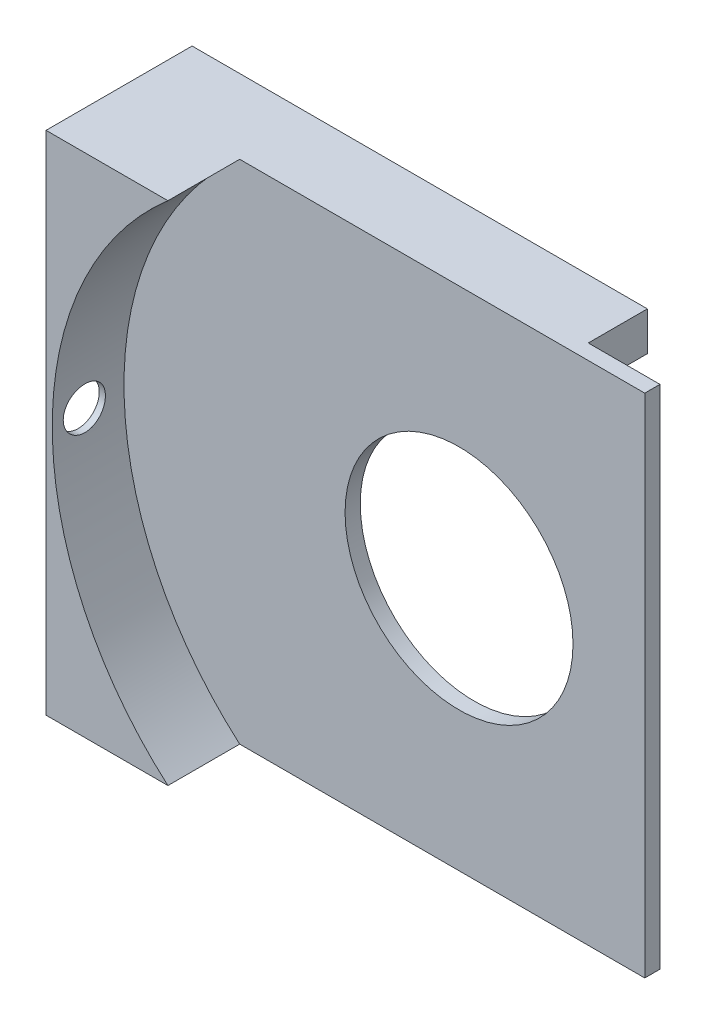
ISO-10303-21;
HEADER;
FILE_DESCRIPTION(('STEP AP214'),'2;1');
FILE_NAME('part.step','',(''),(''),'','','');
FILE_SCHEMA(('AUTOMOTIVE_DESIGN { 1 0 10303 214 1 1 1 1 }'));
ENDSEC;
DATA;
#1=APPLICATION_CONTEXT('core data for automotive mechanical design processes');
#2=APPLICATION_PROTOCOL_DEFINITION('international standard','automotive_design',2000,#1);
#3=PRODUCT_CONTEXT('',#1,'mechanical');
#4=PRODUCT('Part','Part','',(#3));
#5=PRODUCT_RELATED_PRODUCT_CATEGORY('part','',(#4));
#6=PRODUCT_DEFINITION_FORMATION('','',#4);
#7=PRODUCT_DEFINITION_CONTEXT('part definition',#1,'design');
#8=PRODUCT_DEFINITION('design','',#6,#7);
#9=PRODUCT_DEFINITION_SHAPE('','',#8);
#10=(LENGTH_UNIT() NAMED_UNIT(*) SI_UNIT(.MILLI.,.METRE.));
#11=(NAMED_UNIT(*) PLANE_ANGLE_UNIT() SI_UNIT($,.RADIAN.));
#12=(NAMED_UNIT(*) SI_UNIT($,.STERADIAN.) SOLID_ANGLE_UNIT());
#13=UNCERTAINTY_MEASURE_WITH_UNIT(LENGTH_MEASURE(1.E-05),#10,'distance_accuracy_value','');
#14=(GEOMETRIC_REPRESENTATION_CONTEXT(3) GLOBAL_UNCERTAINTY_ASSIGNED_CONTEXT((#13)) GLOBAL_UNIT_ASSIGNED_CONTEXT((#10,
#11,#12)) REPRESENTATION_CONTEXT('',''));
#15=CARTESIAN_POINT('',(0.,0.,0.));
#16=DIRECTION('',(0.,0.,1.));
#17=DIRECTION('',(1.,0.,0.));
#18=AXIS2_PLACEMENT_3D('',#15,#16,#17);
#19=CARTESIAN_POINT('',(0.,0.,1.8));
#20=DIRECTION('',(0.,0.,1.));
#21=DIRECTION('',(1.,0.,0.));
#22=AXIS2_PLACEMENT_3D('',#19,#20,#21);
#23=PLANE('',#22);
#24=CARTESIAN_POINT('',(15.4943062439211,0.0942624622545622,1.8));
#25=DIRECTION('',(0.,0.,1.));
#26=DIRECTION('',(1.,0.,0.));
#27=AXIS2_PLACEMENT_3D('',#24,#25,#26);
#28=CIRCLE('',#27,13.5);
#29=CARTESIAN_POINT('',(28.9943062439211,0.0942624622545622,1.8));
#30=VERTEX_POINT('',#29);
#31=EDGE_CURVE('E212',#30,#30,#28,.T.);
#32=ORIENTED_EDGE('',*,*,#31,.F.);
#33=EDGE_LOOP('',(#32));
#34=FACE_BOUND('',#33,.T.);
#35=DIRECTION('',(1.,0.,0.));
#36=VECTOR('',#35,1.);
#37=CARTESIAN_POINT('',(0.,30.0942624622545,1.8));
#38=LINE('',#37,#36);
#39=CARTESIAN_POINT('',(-10.4883351970487,30.0942624622545,1.8));
#40=VERTEX_POINT('',#39);
#41=CARTESIAN_POINT('',(37.494306243921,30.0942624622545,1.8));
#42=VERTEX_POINT('',#41);
#43=EDGE_CURVE('E219',#40,#42,#38,.T.);
#44=ORIENTED_EDGE('',*,*,#43,.F.);
#45=CARTESIAN_POINT('',(15.4943062439211,0.0942624622546004,1.8));
#46=DIRECTION('',(0.,0.,1.));
#47=DIRECTION('',(1.,0.,0.));
#48=AXIS2_PLACEMENT_3D('',#45,#46,#47);
#49=CIRCLE('',#48,39.6875);
#50=CARTESIAN_POINT('',(-10.4883351970487,-29.9057375377455,1.8));
#51=VERTEX_POINT('',#50);
#52=EDGE_CURVE('E132',#40,#51,#49,.T.);
#53=ORIENTED_EDGE('',*,*,#52,.T.);
#54=DIRECTION('',(1.,0.,0.));
#55=VECTOR('',#54,1.);
#56=CARTESIAN_POINT('',(0.,-29.9057375377455,1.8));
#57=LINE('',#56,#55);
#58=CARTESIAN_POINT('',(37.494306243921,-29.9057375377455,1.8));
#59=VERTEX_POINT('',#58);
#60=EDGE_CURVE('E221',#51,#59,#57,.T.);
#61=ORIENTED_EDGE('',*,*,#60,.T.);
#62=DIRECTION('',(0.,-1.,0.));
#63=VECTOR('',#62,1.);
#64=CARTESIAN_POINT('',(37.494306243921,0.,1.8));
#65=LINE('',#64,#63);
#66=EDGE_CURVE('E215',#42,#59,#65,.T.);
#67=ORIENTED_EDGE('',*,*,#66,.F.);
#68=EDGE_LOOP('',(#44,#53,#61,#67));
#69=FACE_BOUND('',#68,.T.);
#70=ADVANCED_FACE('F39',(#34,#69),#23,.T.);
#71=CARTESIAN_POINT('',(0.,0.,0.));
#72=DIRECTION('',(0.,0.,1.));
#73=DIRECTION('',(1.,0.,0.));
#74=AXIS2_PLACEMENT_3D('',#71,#72,#73);
#75=PLANE('',#74);
#76=CARTESIAN_POINT('',(15.4943062439211,0.0942624622545622,0.));
#77=DIRECTION('',(0.,0.,1.));
#78=DIRECTION('',(1.,0.,0.));
#79=AXIS2_PLACEMENT_3D('',#76,#77,#78);
#80=CIRCLE('',#79,13.5);
#81=CARTESIAN_POINT('',(28.9943062439211,0.0942624622545622,0.));
#82=VERTEX_POINT('',#81);
#83=EDGE_CURVE('E207',#82,#82,#80,.T.);
#84=ORIENTED_EDGE('',*,*,#83,.T.);
#85=EDGE_LOOP('',(#84));
#86=FACE_BOUND('',#85,.T.);
#87=DIRECTION('',(0.,-1.,0.));
#88=VECTOR('',#87,1.);
#89=CARTESIAN_POINT('',(29.0043062439211,0.,0.));
#90=LINE('',#89,#88);
#91=CARTESIAN_POINT('',(29.0043062439211,30.0942624622545,0.));
#92=VERTEX_POINT('',#91);
#93=CARTESIAN_POINT('',(29.0043062439211,25.4942624622546,0.));
#94=VERTEX_POINT('',#93);
#95=EDGE_CURVE('E168',#92,#94,#90,.T.);
#96=ORIENTED_EDGE('',*,*,#95,.F.);
#97=DIRECTION('',(1.,0.,0.));
#98=VECTOR('',#97,1.);
#99=CARTESIAN_POINT('',(0.,30.0942624622545,0.));
#100=LINE('',#99,#98);
#101=CARTESIAN_POINT('',(37.494306243921,30.0942624622545,0.));
#102=VERTEX_POINT('',#101);
#103=EDGE_CURVE('E229',#92,#102,#100,.T.);
#104=ORIENTED_EDGE('',*,*,#103,.T.);
#105=DIRECTION('',(0.,-1.,0.));
#106=VECTOR('',#105,1.);
#107=CARTESIAN_POINT('',(37.494306243921,0.,0.));
#108=LINE('',#107,#106);
#109=CARTESIAN_POINT('',(37.494306243921,-29.9057375377455,0.));
#110=VERTEX_POINT('',#109);
#111=EDGE_CURVE('E226',#102,#110,#108,.T.);
#112=ORIENTED_EDGE('',*,*,#111,.T.);
#113=DIRECTION('',(1.,0.,0.));
#114=VECTOR('',#113,1.);
#115=CARTESIAN_POINT('',(0.,-29.9057375377455,0.));
#116=LINE('',#115,#114);
#117=CARTESIAN_POINT('',(29.0043062439211,-29.9057375377455,0.));
#118=VERTEX_POINT('',#117);
#119=EDGE_CURVE('E216',#118,#110,#116,.T.);
#120=ORIENTED_EDGE('',*,*,#119,.F.);
#121=DIRECTION('',(0.,1.,0.));
#122=VECTOR('',#121,1.);
#123=CARTESIAN_POINT('',(29.0043062439211,0.,0.));
#124=LINE('',#123,#122);
#125=CARTESIAN_POINT('',(29.0043062439211,-25.3057375377454,0.));
#126=VERTEX_POINT('',#125);
#127=EDGE_CURVE('E190',#118,#126,#124,.T.);
#128=ORIENTED_EDGE('',*,*,#127,.T.);
#129=DIRECTION('',(-1.,0.,0.));
#130=VECTOR('',#129,1.);
#131=CARTESIAN_POINT('',(0.,-25.3057375377455,0.));
#132=LINE('',#131,#130);
#133=CARTESIAN_POINT('',(-24.926493756079,-25.3057375377455,0.));
#134=VERTEX_POINT('',#133);
#135=EDGE_CURVE('E180',#126,#134,#132,.T.);
#136=ORIENTED_EDGE('',*,*,#135,.T.);
#137=DIRECTION('',(0.,-1.,0.));
#138=VECTOR('',#137,1.);
#139=CARTESIAN_POINT('',(-24.926493756079,0.,0.));
#140=LINE('',#139,#138);
#141=CARTESIAN_POINT('',(-24.926493756079,25.4942624622546,0.));
#142=VERTEX_POINT('',#141);
#143=EDGE_CURVE('E231',#142,#134,#140,.T.);
#144=ORIENTED_EDGE('',*,*,#143,.F.);
#145=DIRECTION('',(-1.,0.,0.));
#146=VECTOR('',#145,1.);
#147=CARTESIAN_POINT('',(0.,25.4942624622546,0.));
#148=LINE('',#147,#146);
#149=EDGE_CURVE('E62',#94,#142,#148,.T.);
#150=ORIENTED_EDGE('',*,*,#149,.F.);
#151=EDGE_LOOP('',(#96,#104,#112,#120,#128,#136,#144,#150));
#152=FACE_BOUND('',#151,.T.);
#153=ADVANCED_FACE('F255',(#86,#152),#75,.F.);
#154=CARTESIAN_POINT('',(37.494306243921,0.,1.8));
#155=DIRECTION('',(1.,0.,0.));
#156=DIRECTION('',(0.,0.,-1.));
#157=AXIS2_PLACEMENT_3D('',#154,#155,#156);
#158=PLANE('',#157);
#159=ORIENTED_EDGE('',*,*,#111,.F.);
#160=DIRECTION('',(0.,0.,-1.));
#161=VECTOR('',#160,1.);
#162=CARTESIAN_POINT('',(37.494306243921,30.0942624622545,1.8));
#163=LINE('',#162,#161);
#164=EDGE_CURVE('E11',#42,#102,#163,.T.);
#165=ORIENTED_EDGE('',*,*,#164,.F.);
#166=ORIENTED_EDGE('',*,*,#66,.T.);
#167=DIRECTION('',(0.,0.,-1.));
#168=VECTOR('',#167,1.);
#169=CARTESIAN_POINT('',(37.494306243921,-29.9057375377455,1.8));
#170=LINE('',#169,#168);
#171=EDGE_CURVE('E223',#59,#110,#170,.T.);
#172=ORIENTED_EDGE('',*,*,#171,.T.);
#173=EDGE_LOOP('',(#159,#165,#166,#172));
#174=FACE_BOUND('',#173,.T.);
#175=ADVANCED_FACE('F273',(#174),#158,.T.);
#176=CARTESIAN_POINT('',(0.,30.0942624622545,1.8));
#177=DIRECTION('',(0.,1.,0.));
#178=DIRECTION('',(0.,0.,1.));
#179=AXIS2_PLACEMENT_3D('',#176,#177,#178);
#180=PLANE('',#179);
#181=ORIENTED_EDGE('',*,*,#103,.F.);
#182=DIRECTION('',(0.,0.,1.));
#183=VECTOR('',#182,1.);
#184=CARTESIAN_POINT('',(29.0043062439211,30.0942624622545,-7.));
#185=LINE('',#184,#183);
#186=CARTESIAN_POINT('',(29.0043062439211,30.0942624622545,-7.));
#187=VERTEX_POINT('',#186);
#188=EDGE_CURVE('E177',#187,#92,#185,.T.);
#189=ORIENTED_EDGE('',*,*,#188,.F.);
#190=DIRECTION('',(-1.,0.,0.));
#191=VECTOR('',#190,1.);
#192=CARTESIAN_POINT('',(0.,30.0942624622545,-7.));
#193=LINE('',#192,#191);
#194=CARTESIAN_POINT('',(-24.926493756079,30.0942624622545,-7.));
#195=VERTEX_POINT('',#194);
#196=EDGE_CURVE('E172',#187,#195,#193,.T.);
#197=ORIENTED_EDGE('',*,*,#196,.T.);
#198=DIRECTION('',(0.,0.,-1.));
#199=VECTOR('',#198,1.);
#200=CARTESIAN_POINT('',(-24.926493756079,30.0942624622545,1.8));
#201=LINE('',#200,#199);
#202=CARTESIAN_POINT('',(-24.926493756079,30.0942624622545,10.3));
#203=VERTEX_POINT('',#202);
#204=EDGE_CURVE('E47',#203,#195,#201,.T.);
#205=ORIENTED_EDGE('',*,*,#204,.F.);
#206=DIRECTION('',(-1.,0.,0.));
#207=VECTOR('',#206,1.);
#208=CARTESIAN_POINT('',(0.,30.0942624622545,10.3));
#209=LINE('',#208,#207);
#210=CARTESIAN_POINT('',(-10.4883351970487,30.0942624622545,10.3));
#211=VERTEX_POINT('',#210);
#212=EDGE_CURVE('E137',#211,#203,#209,.T.);
#213=ORIENTED_EDGE('',*,*,#212,.F.);
#214=DIRECTION('',(0.,0.,-1.));
#215=VECTOR('',#214,1.);
#216=CARTESIAN_POINT('',(-10.4883351970487,30.0942624622545,10.3));
#217=LINE('',#216,#215);
#218=EDGE_CURVE('E127',#211,#40,#217,.T.);
#219=ORIENTED_EDGE('',*,*,#218,.T.);
#220=ORIENTED_EDGE('',*,*,#43,.T.);
#221=ORIENTED_EDGE('',*,*,#164,.T.);
#222=EDGE_LOOP('',(#181,#189,#197,#205,#213,#219,#220,#221));
#223=FACE_BOUND('',#222,.T.);
#224=ADVANCED_FACE('F139',(#223),#180,.T.);
#225=CARTESIAN_POINT('',(-24.926493756079,0.,1.8));
#226=DIRECTION('',(1.,0.,0.));
#227=DIRECTION('',(0.,0.,-1.));
#228=AXIS2_PLACEMENT_3D('',#225,#226,#227);
#229=PLANE('',#228);
#230=CARTESIAN_POINT('',(-24.926493756079,0.0942624622546143,6.49900000000002));
#231=DIRECTION('',(-1.,0.,0.));
#232=DIRECTION('',(0.,0.,1.));
#233=AXIS2_PLACEMENT_3D('',#230,#231,#232);
#234=CIRCLE('',#233,2.5);
#235=CARTESIAN_POINT('',(-24.926493756079,0.0942624622546143,8.99900000000002));
#236=VERTEX_POINT('',#235);
#237=EDGE_CURVE('E150',#236,#236,#234,.T.);
#238=ORIENTED_EDGE('',*,*,#237,.F.);
#239=EDGE_LOOP('',(#238));
#240=FACE_BOUND('',#239,.T.);
#241=ORIENTED_EDGE('',*,*,#204,.T.);
#242=DIRECTION('',(0.,-1.,0.));
#243=VECTOR('',#242,1.);
#244=CARTESIAN_POINT('',(-24.926493756079,0.,-7.));
#245=LINE('',#244,#243);
#246=CARTESIAN_POINT('',(-24.926493756079,25.4942624622546,-7.));
#247=VERTEX_POINT('',#246);
#248=EDGE_CURVE('E164',#195,#247,#245,.T.);
#249=ORIENTED_EDGE('',*,*,#248,.T.);
#250=DIRECTION('',(0.,0.,1.));
#251=VECTOR('',#250,1.);
#252=CARTESIAN_POINT('',(-24.926493756079,25.4942624622546,-7.));
#253=LINE('',#252,#251);
#254=EDGE_CURVE('E174',#247,#142,#253,.T.);
#255=ORIENTED_EDGE('',*,*,#254,.T.);
#256=ORIENTED_EDGE('',*,*,#143,.T.);
#257=DIRECTION('',(0.,0.,1.));
#258=VECTOR('',#257,1.);
#259=CARTESIAN_POINT('',(-24.926493756079,-25.3057375377455,-7.));
#260=LINE('',#259,#258);
#261=CARTESIAN_POINT('',(-24.926493756079,-25.3057375377455,-7.));
#262=VERTEX_POINT('',#261);
#263=EDGE_CURVE('E199',#262,#134,#260,.T.);
#264=ORIENTED_EDGE('',*,*,#263,.F.);
#265=DIRECTION('',(0.,-1.,0.));
#266=VECTOR('',#265,1.);
#267=CARTESIAN_POINT('',(-24.926493756079,0.,-7.));
#268=LINE('',#267,#266);
#269=CARTESIAN_POINT('',(-24.926493756079,-29.9057375377455,-7.));
#270=VERTEX_POINT('',#269);
#271=EDGE_CURVE('E189',#262,#270,#268,.T.);
#272=ORIENTED_EDGE('',*,*,#271,.T.);
#273=DIRECTION('',(0.,0.,-1.));
#274=VECTOR('',#273,1.);
#275=CARTESIAN_POINT('',(-24.926493756079,-29.9057375377455,1.8));
#276=LINE('',#275,#274);
#277=CARTESIAN_POINT('',(-24.926493756079,-29.9057375377455,10.3));
#278=VERTEX_POINT('',#277);
#279=EDGE_CURVE('E236',#278,#270,#276,.T.);
#280=ORIENTED_EDGE('',*,*,#279,.F.);
#281=DIRECTION('',(0.,-1.,0.));
#282=VECTOR('',#281,1.);
#283=CARTESIAN_POINT('',(-24.926493756079,0.,10.3));
#284=LINE('',#283,#282);
#285=EDGE_CURVE('E144',#203,#278,#284,.T.);
#286=ORIENTED_EDGE('',*,*,#285,.F.);
#287=EDGE_LOOP('',(#241,#249,#255,#256,#264,#272,#280,#286));
#288=FACE_BOUND('',#287,.T.);
#289=ADVANCED_FACE('F239',(#240,#288),#229,.F.);
#290=CARTESIAN_POINT('',(15.4943062439211,0.0942624622545622,1.8));
#291=DIRECTION('',(0.,0.,-1.));
#292=DIRECTION('',(-1.,0.,0.));
#293=AXIS2_PLACEMENT_3D('',#290,#291,#292);
#294=CYLINDRICAL_SURFACE('',#293,13.5);
#295=ORIENTED_EDGE('',*,*,#31,.T.);
#296=EDGE_LOOP('',(#295));
#297=FACE_BOUND('',#296,.T.);
#298=ORIENTED_EDGE('',*,*,#83,.F.);
#299=EDGE_LOOP('',(#298));
#300=FACE_BOUND('',#299,.T.);
#301=ADVANCED_FACE('F41',(#297,#300),#294,.F.);
#302=CARTESIAN_POINT('',(0.,-29.9057375377455,1.8));
#303=DIRECTION('',(0.,1.,0.));
#304=DIRECTION('',(0.,0.,1.));
#305=AXIS2_PLACEMENT_3D('',#302,#303,#304);
#306=PLANE('',#305);
#307=ORIENTED_EDGE('',*,*,#279,.T.);
#308=DIRECTION('',(1.,0.,0.));
#309=VECTOR('',#308,1.);
#310=CARTESIAN_POINT('',(0.,-29.9057375377455,-7.));
#311=LINE('',#310,#309);
#312=CARTESIAN_POINT('',(29.0043062439211,-29.9057375377455,-7.));
#313=VERTEX_POINT('',#312);
#314=EDGE_CURVE('E193',#270,#313,#311,.T.);
#315=ORIENTED_EDGE('',*,*,#314,.T.);
#316=DIRECTION('',(0.,0.,1.));
#317=VECTOR('',#316,1.);
#318=CARTESIAN_POINT('',(29.0043062439211,-29.9057375377455,-7.));
#319=LINE('',#318,#317);
#320=EDGE_CURVE('E208',#313,#118,#319,.T.);
#321=ORIENTED_EDGE('',*,*,#320,.T.);
#322=ORIENTED_EDGE('',*,*,#119,.T.);
#323=ORIENTED_EDGE('',*,*,#171,.F.);
#324=ORIENTED_EDGE('',*,*,#60,.F.);
#325=DIRECTION('',(0.,0.,-1.));
#326=VECTOR('',#325,1.);
#327=CARTESIAN_POINT('',(-10.4883351970487,-29.9057375377455,10.3));
#328=LINE('',#327,#326);
#329=CARTESIAN_POINT('',(-10.4883351970487,-29.9057375377455,10.3));
#330=VERTEX_POINT('',#329);
#331=EDGE_CURVE('E54',#330,#51,#328,.T.);
#332=ORIENTED_EDGE('',*,*,#331,.F.);
#333=DIRECTION('',(1.,0.,0.));
#334=VECTOR('',#333,1.);
#335=CARTESIAN_POINT('',(0.,-29.9057375377455,10.3));
#336=LINE('',#335,#334);
#337=EDGE_CURVE('E148',#278,#330,#336,.T.);
#338=ORIENTED_EDGE('',*,*,#337,.F.);
#339=EDGE_LOOP('',(#307,#315,#321,#322,#323,#324,#332,#338));
#340=FACE_BOUND('',#339,.T.);
#341=ADVANCED_FACE('F265',(#340),#306,.F.);
#342=CARTESIAN_POINT('',(0.,-25.3057375377455,-7.));
#343=DIRECTION('',(0.,1.,0.));
#344=DIRECTION('',(-1.,0.,0.));
#345=AXIS2_PLACEMENT_3D('',#342,#343,#344);
#346=PLANE('',#345);
#347=ORIENTED_EDGE('',*,*,#135,.F.);
#348=DIRECTION('',(0.,0.,1.));
#349=VECTOR('',#348,1.);
#350=CARTESIAN_POINT('',(29.0043062439211,-25.3057375377454,-7.));
#351=LINE('',#350,#349);
#352=CARTESIAN_POINT('',(29.0043062439211,-25.3057375377454,-7.));
#353=VERTEX_POINT('',#352);
#354=EDGE_CURVE('E204',#353,#126,#351,.T.);
#355=ORIENTED_EDGE('',*,*,#354,.F.);
#356=DIRECTION('',(-1.,0.,0.));
#357=VECTOR('',#356,1.);
#358=CARTESIAN_POINT('',(0.,-25.3057375377455,-7.));
#359=LINE('',#358,#357);
#360=EDGE_CURVE('E186',#353,#262,#359,.T.);
#361=ORIENTED_EDGE('',*,*,#360,.T.);
#362=ORIENTED_EDGE('',*,*,#263,.T.);
#363=EDGE_LOOP('',(#347,#355,#361,#362));
#364=FACE_BOUND('',#363,.T.);
#365=ADVANCED_FACE('F253',(#364),#346,.T.);
#366=CARTESIAN_POINT('',(29.0043062439211,0.,-7.));
#367=DIRECTION('',(1.,0.,0.));
#368=DIRECTION('',(0.,0.,-1.));
#369=AXIS2_PLACEMENT_3D('',#366,#367,#368);
#370=PLANE('',#369);
#371=ORIENTED_EDGE('',*,*,#127,.F.);
#372=ORIENTED_EDGE('',*,*,#320,.F.);
#373=DIRECTION('',(0.,1.,0.));
#374=VECTOR('',#373,1.);
#375=CARTESIAN_POINT('',(29.0043062439211,0.,-7.));
#376=LINE('',#375,#374);
#377=EDGE_CURVE('E196',#313,#353,#376,.T.);
#378=ORIENTED_EDGE('',*,*,#377,.T.);
#379=ORIENTED_EDGE('',*,*,#354,.T.);
#380=EDGE_LOOP('',(#371,#372,#378,#379));
#381=FACE_BOUND('',#380,.T.);
#382=ADVANCED_FACE('F259',(#381),#370,.T.);
#383=CARTESIAN_POINT('',(0.,0.,-7.));
#384=DIRECTION('',(0.,0.,1.));
#385=DIRECTION('',(1.,0.,0.));
#386=AXIS2_PLACEMENT_3D('',#383,#384,#385);
#387=PLANE('',#386);
#388=ORIENTED_EDGE('',*,*,#360,.F.);
#389=ORIENTED_EDGE('',*,*,#377,.F.);
#390=ORIENTED_EDGE('',*,*,#314,.F.);
#391=ORIENTED_EDGE('',*,*,#271,.F.);
#392=EDGE_LOOP('',(#388,#389,#390,#391));
#393=FACE_BOUND('',#392,.T.);
#394=ADVANCED_FACE('F262',(#393),#387,.F.);
#395=CARTESIAN_POINT('',(29.0043062439211,0.,-7.));
#396=DIRECTION('',(-1.,0.,0.));
#397=DIRECTION('',(0.,0.,1.));
#398=AXIS2_PLACEMENT_3D('',#395,#396,#397);
#399=PLANE('',#398);
#400=ORIENTED_EDGE('',*,*,#95,.T.);
#401=DIRECTION('',(0.,0.,1.));
#402=VECTOR('',#401,1.);
#403=CARTESIAN_POINT('',(29.0043062439211,25.4942624622546,-7.));
#404=LINE('',#403,#402);
#405=CARTESIAN_POINT('',(29.0043062439211,25.4942624622546,-7.));
#406=VERTEX_POINT('',#405);
#407=EDGE_CURVE('E181',#406,#94,#404,.T.);
#408=ORIENTED_EDGE('',*,*,#407,.F.);
#409=DIRECTION('',(0.,-1.,0.));
#410=VECTOR('',#409,1.);
#411=CARTESIAN_POINT('',(29.0043062439211,0.,-7.));
#412=LINE('',#411,#410);
#413=EDGE_CURVE('E170',#187,#406,#412,.T.);
#414=ORIENTED_EDGE('',*,*,#413,.F.);
#415=ORIENTED_EDGE('',*,*,#188,.T.);
#416=EDGE_LOOP('',(#400,#408,#414,#415));
#417=FACE_BOUND('',#416,.T.);
#418=ADVANCED_FACE('F248',(#417),#399,.F.);
#419=CARTESIAN_POINT('',(0.,25.4942624622546,-7.));
#420=DIRECTION('',(0.,1.,0.));
#421=DIRECTION('',(-1.,0.,0.));
#422=AXIS2_PLACEMENT_3D('',#419,#420,#421);
#423=PLANE('',#422);
#424=ORIENTED_EDGE('',*,*,#149,.T.);
#425=ORIENTED_EDGE('',*,*,#254,.F.);
#426=DIRECTION('',(-1.,0.,0.));
#427=VECTOR('',#426,1.);
#428=CARTESIAN_POINT('',(0.,25.4942624622546,-7.));
#429=LINE('',#428,#427);
#430=EDGE_CURVE('E167',#406,#247,#429,.T.);
#431=ORIENTED_EDGE('',*,*,#430,.F.);
#432=ORIENTED_EDGE('',*,*,#407,.T.);
#433=EDGE_LOOP('',(#424,#425,#431,#432));
#434=FACE_BOUND('',#433,.T.);
#435=ADVANCED_FACE('F250',(#434),#423,.F.);
#436=CARTESIAN_POINT('',(0.,0.,-7.));
#437=DIRECTION('',(0.,0.,-1.));
#438=DIRECTION('',(-1.,0.,0.));
#439=AXIS2_PLACEMENT_3D('',#436,#437,#438);
#440=PLANE('',#439);
#441=ORIENTED_EDGE('',*,*,#248,.F.);
#442=ORIENTED_EDGE('',*,*,#196,.F.);
#443=ORIENTED_EDGE('',*,*,#413,.T.);
#444=ORIENTED_EDGE('',*,*,#430,.T.);
#445=EDGE_LOOP('',(#441,#442,#443,#444));
#446=FACE_BOUND('',#445,.T.);
#447=ADVANCED_FACE('F242',(#446),#440,.T.);
#448=CARTESIAN_POINT('',(15.4943062439211,0.0942624622546004,10.3));
#449=DIRECTION('',(0.,0.,-1.));
#450=DIRECTION('',(-1.,0.,0.));
#451=AXIS2_PLACEMENT_3D('',#448,#449,#450);
#452=CYLINDRICAL_SURFACE('',#451,39.6875);
#453=CARTESIAN_POINT('',(-24.1931937560789,0.0942624622546143,8.99900000000002));
#454=CARTESIAN_POINT('',(-24.1931927096296,0.234539326667329,8.99899382867569));
#455=CARTESIAN_POINT('',(-24.1924420826654,0.374914356667997,8.98715376650837));
#456=CARTESIAN_POINT('',(-24.1895198473023,0.651788184771432,8.94009144527026));
#457=CARTESIAN_POINT('',(-24.1873465859458,0.788282280887939,8.90484198614911));
#458=CARTESIAN_POINT('',(-24.1818249305879,1.05334364382032,8.81197747400502));
#459=CARTESIAN_POINT('',(-24.1784771574805,1.18191505674691,8.75437423638039));
#460=CARTESIAN_POINT('',(-24.1709829870618,1.42753034743987,8.61845650668846));
#461=CARTESIAN_POINT('',(-24.1668367724625,1.54457685327329,8.5401467514853));
#462=CARTESIAN_POINT('',(-24.1582047125252,1.76403117231944,8.36490859425107));
#463=CARTESIAN_POINT('',(-24.1537184196906,1.8664191669646,8.26795539301748));
#464=CARTESIAN_POINT('',(-24.1449156531867,2.05348055042438,8.05823362732526));
#465=CARTESIAN_POINT('',(-24.1405991866269,2.13815319826143,7.94546440166116));
#466=CARTESIAN_POINT('',(-24.1326193928014,2.28744157491758,7.70719925123159));
#467=CARTESIAN_POINT('',(-24.1289566036053,2.35204081258025,7.58169297413117));
#468=CARTESIAN_POINT('',(-24.1227030196005,2.4592431138854,7.32158894984783));
#469=CARTESIAN_POINT('',(-24.1201122131136,2.50184641715334,7.18699130172511));
#470=CARTESIAN_POINT('',(-24.1162990279582,2.56379242104692,6.91271642197379));
#471=CARTESIAN_POINT('',(-24.1150748208321,2.58316620446173,6.7730462363391));
#472=CARTESIAN_POINT('',(-24.1141274129087,2.59819917120903,6.49243129403287));
#473=CARTESIAN_POINT('',(-24.114404194885,2.59385862670388,6.35148655200757));
#474=CARTESIAN_POINT('',(-24.1164258549458,2.56161194256508,6.0725352244387));
#475=CARTESIAN_POINT('',(-24.1181686373313,2.53373944247659,5.93452473287582));
#476=CARTESIAN_POINT('',(-24.12292259804,2.45527222401637,5.66514517732339));
#477=CARTESIAN_POINT('',(-24.1259337840611,2.40467736774289,5.53377615364623));
#478=CARTESIAN_POINT('',(-24.1328876234074,2.2821634620016,5.28130057077256));
#479=CARTESIAN_POINT('',(-24.1368309427394,2.21022915614142,5.16020143383454));
#480=CARTESIAN_POINT('',(-24.1452039979551,2.04708935846841,4.93178433337733));
#481=CARTESIAN_POINT('',(-24.1496337393963,1.95588364646588,4.8244665273423));
#482=CARTESIAN_POINT('',(-24.1584897443959,1.75660058427265,4.6264627281182));
#483=CARTESIAN_POINT('',(-24.1629159884547,1.64849412150464,4.53580603213443));
#484=CARTESIAN_POINT('',(-24.1712587760927,1.41858035470788,4.37392385956931));
#485=CARTESIAN_POINT('',(-24.1751753194911,1.29677304582146,4.30269838987739));
#486=CARTESIAN_POINT('',(-24.1820576900614,1.04289745760051,4.18170296842391));
#487=CARTESIAN_POINT('',(-24.1850234678937,0.91082864619209,4.1319341300974));
#488=CARTESIAN_POINT('',(-24.1896694451178,0.640186958459287,4.0552843173336));
#489=CARTESIAN_POINT('',(-24.1913496597603,0.501614159312583,4.02840307137976));
#490=CARTESIAN_POINT('',(-24.1932332121397,0.222152259458833,3.9983278149694));
#491=CARTESIAN_POINT('',(-24.1934390753265,0.0812675341300322,3.99509329929648));
#492=CARTESIAN_POINT('',(-24.1923574449776,-0.199042475112896,4.01229748013727));
#493=CARTESIAN_POINT('',(-24.1910699593379,-0.338467766739776,4.03273605148068));
#494=CARTESIAN_POINT('',(-24.1871481926652,-0.611786997839172,4.0966726910928));
#495=CARTESIAN_POINT('',(-24.1845149973094,-0.745685302344708,4.14015217170948));
#496=CARTESIAN_POINT('',(-24.1781980459571,-1.00428441093436,4.24891752514271));
#497=CARTESIAN_POINT('',(-24.1745142803636,-1.12898513098477,4.314203597165));
#498=CARTESIAN_POINT('',(-24.1665037982726,-1.3658347358824,4.46483198408045));
#499=CARTESIAN_POINT('',(-24.1621762176083,-1.4779663895037,4.55020134688826));
#500=CARTESIAN_POINT('',(-24.1533680080569,-1.68632138169168,4.73853362786361));
#501=CARTESIAN_POINT('',(-24.14888737764,-1.78254456119834,4.8414967219202));
#502=CARTESIAN_POINT('',(-24.1402707511483,-1.95648842439499,5.06226849368846));
#503=CARTESIAN_POINT('',(-24.1361352499428,-2.03418282685817,5.18009790006254));
#504=CARTESIAN_POINT('',(-24.128683130822,-2.16868389338953,5.42715338408231));
#505=CARTESIAN_POINT('',(-24.1253665077924,-2.22549068791455,5.5563793905425));
#506=CARTESIAN_POINT('',(-24.1199297395692,-2.31655850925299,5.82246388749832));
#507=CARTESIAN_POINT('',(-24.1178087171899,-2.35083606834004,5.95931670115473));
#508=CARTESIAN_POINT('',(-24.1149999096669,-2.3959263949612,6.23684890214691));
#509=CARTESIAN_POINT('',(-24.1143121100299,-2.40673939977526,6.37752825077314));
#510=CARTESIAN_POINT('',(-24.11444766328,-2.40459137772283,6.65845882342712));
#511=CARTESIAN_POINT('',(-24.1152683898766,-2.39167166868775,6.79871036651286));
#512=CARTESIAN_POINT('',(-24.1183229453208,-2.3425106343441,7.07504847695684));
#513=CARTESIAN_POINT('',(-24.120556776722,-2.30626926688984,7.21113503678787));
#514=CARTESIAN_POINT('',(-24.1261851663508,-2.21150299508861,7.47528635387653));
#515=CARTESIAN_POINT('',(-24.129579715346,-2.15297826798439,7.60335117492995));
#516=CARTESIAN_POINT('',(-24.137146949772,-2.0153122480195,7.84784250216044));
#517=CARTESIAN_POINT('',(-24.1413196152089,-1.93617148486948,7.96426930725959));
#518=CARTESIAN_POINT('',(-24.1499813396059,-1.75936711661199,8.18238922946319));
#519=CARTESIAN_POINT('',(-24.1544709015964,-1.6616736263318,8.28405810140606));
#520=CARTESIAN_POINT('',(-24.163256225966,-1.45057738745189,8.46958807533559));
#521=CARTESIAN_POINT('',(-24.1675519406713,-1.33717080205982,8.55344481528487));
#522=CARTESIAN_POINT('',(-24.1754700403388,-1.09773666224375,8.7010329014499));
#523=CARTESIAN_POINT('',(-24.1790915771839,-0.971693513443264,8.7647389675402));
#524=CARTESIAN_POINT('',(-24.1852418909066,-0.710768810569864,8.87000631261598));
#525=CARTESIAN_POINT('',(-24.1877719464522,-0.5758978129034,8.91159351717915));
#526=CARTESIAN_POINT('',(-24.1907914850563,-0.351124828878794,8.96063824794232));
#527=CARTESIAN_POINT('',(-24.1916883311224,-0.262675613489677,8.97500529254781));
#528=CARTESIAN_POINT('',(-24.1928898001327,-0.0847434374133925,8.99418813108999));
#529=CARTESIAN_POINT('',(-24.1931944239098,0.00473952181946958,8.99900393846202));
#530=CARTESIAN_POINT('',(-24.1931937560789,0.0942624622546143,8.99900000000002));
#531=B_SPLINE_CURVE_WITH_KNOTS('',3,(#453,#454,#455,#456,#457,#458,#459,#460,#461,#462,#463,
#464,#465,#466,#467,#468,#469,#470,#471,#472,#473,#474,#475,#476,#477,#478,#479,#480,#481,#482,
#483,#484,#485,#486,#487,#488,#489,#490,#491,#492,#493,#494,#495,#496,#497,#498,#499,#500,#501,
#502,#503,#504,#505,#506,#507,#508,#509,#510,#511,#512,#513,#514,#515,#516,#517,#518,#519,#520,
#521,#522,#523,#524,#525,#526,#527,#528,#529,#530),.UNSPECIFIED.,.T.,.F.,(4,2,2,2,2,2,2,2,2,2,2,
2,2,2,2,2,2,2,2,2,2,2,2,2,2,2,2,2,2,2,2,2,2,2,2,2,2,2,4),(0.,0.420503780440228,
0.841497013150636,1.26226802649644,1.68294286657974,2.10418120136911,2.52543715172043,
2.94703827223859,3.36863479970353,3.78966656850538,4.21069350525943,4.63111959010883,
5.05154822655443,5.47227817098056,5.89301292280909,6.31448056796846,6.73594836256112,
7.15743802547714,7.57892268817226,7.99968520720863,8.42044550149351,8.84086687397932,
9.26129208716825,9.68228679828736,10.1032857184452,10.5248782786188,10.9464682056252,
11.3677484175111,11.7890243692771,12.2095675892274,12.630111569164,13.0506522041471,
13.4711820347794,13.8923951005797,14.313711199202,14.7355537845966,15.1569008313996,
15.4252614623573,15.6936217158226),.UNSPECIFIED.);
#532=CARTESIAN_POINT('',(-24.1931937560789,0.0942624622546143,8.99900000000002));
#533=VERTEX_POINT('',#532);
#534=EDGE_CURVE('E153',#533,#533,#531,.T.);
#535=ORIENTED_EDGE('',*,*,#534,.T.);
#536=EDGE_LOOP('',(#535));
#537=FACE_BOUND('',#536,.T.);
#538=ORIENTED_EDGE('',*,*,#52,.F.);
#539=ORIENTED_EDGE('',*,*,#218,.F.);
#540=CARTESIAN_POINT('',(15.4943062439211,0.0942624622546004,10.3));
#541=DIRECTION('',(0.,0.,1.));
#542=DIRECTION('',(1.,0.,0.));
#543=AXIS2_PLACEMENT_3D('',#540,#541,#542);
#544=CIRCLE('',#543,39.6875);
#545=EDGE_CURVE('E131',#211,#330,#544,.T.);
#546=ORIENTED_EDGE('',*,*,#545,.T.);
#547=ORIENTED_EDGE('',*,*,#331,.T.);
#548=EDGE_LOOP('',(#538,#539,#546,#547));
#549=FACE_BOUND('',#548,.T.);
#550=ADVANCED_FACE('F129',(#537,#549),#452,.F.);
#551=CARTESIAN_POINT('',(0.,0.,10.3));
#552=DIRECTION('',(0.,0.,1.));
#553=DIRECTION('',(1.,0.,0.));
#554=AXIS2_PLACEMENT_3D('',#551,#552,#553);
#555=PLANE('',#554);
#556=ORIENTED_EDGE('',*,*,#545,.F.);
#557=ORIENTED_EDGE('',*,*,#212,.T.);
#558=ORIENTED_EDGE('',*,*,#285,.T.);
#559=ORIENTED_EDGE('',*,*,#337,.T.);
#560=EDGE_LOOP('',(#556,#557,#558,#559));
#561=FACE_BOUND('',#560,.T.);
#562=ADVANCED_FACE('F146',(#561),#555,.T.);
#563=CARTESIAN_POINT('',(37.495306243921,0.0942624622546143,6.49900000000002));
#564=DIRECTION('',(-1.,0.,0.));
#565=DIRECTION('',(0.,0.,1.));
#566=AXIS2_PLACEMENT_3D('',#563,#564,#565);
#567=CYLINDRICAL_SURFACE('',#566,2.5);
#568=ORIENTED_EDGE('',*,*,#534,.F.);
#569=EDGE_LOOP('',(#568));
#570=FACE_BOUND('',#569,.T.);
#571=ORIENTED_EDGE('',*,*,#237,.T.);
#572=EDGE_LOOP('',(#571));
#573=FACE_BOUND('',#572,.T.);
#574=ADVANCED_FACE('F306',(#570,#573),#567,.F.);
#575=CLOSED_SHELL('',(#70,#153,#175,#224,#289,#301,#341,#365,#382,#394,#418,#435,#447,#550,#562,#574));
#576=MANIFOLD_SOLID_BREP('B2',#575);
#577=ADVANCED_BREP_SHAPE_REPRESENTATION('',(#18,#576),#14);
#578=SHAPE_DEFINITION_REPRESENTATION(#9,#577);
ENDSEC;
END-ISO-10303-21;
